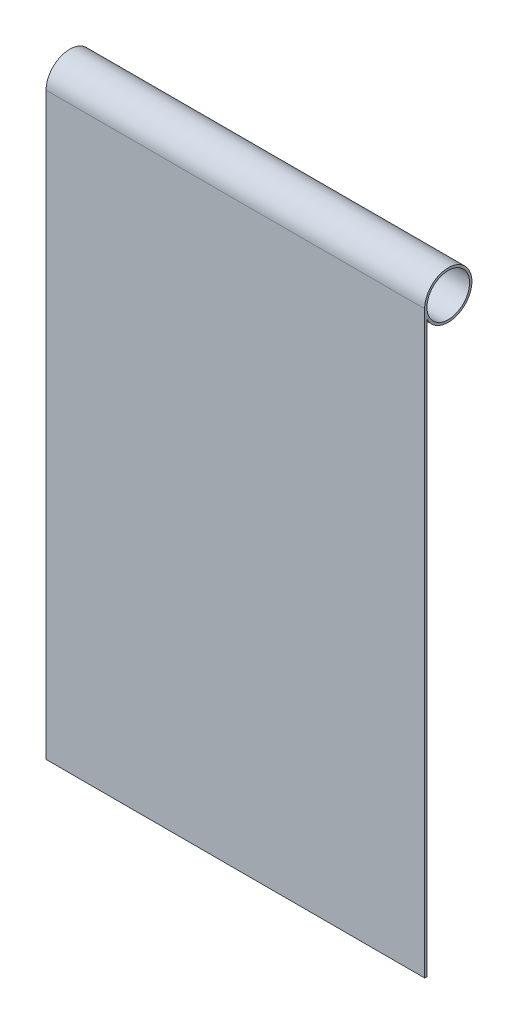
ISO-10303-21;
HEADER;
FILE_DESCRIPTION(('STEP AP214'),'2;1');
FILE_NAME('part.step','',(''),(''),'','','');
FILE_SCHEMA(('AUTOMOTIVE_DESIGN { 1 0 10303 214 1 1 1 1 }'));
ENDSEC;
DATA;
#1=APPLICATION_CONTEXT('core data for automotive mechanical design processes');
#2=APPLICATION_PROTOCOL_DEFINITION('international standard','automotive_design',2000,#1);
#3=PRODUCT_CONTEXT('',#1,'mechanical');
#4=PRODUCT('Part','Part','',(#3));
#5=PRODUCT_RELATED_PRODUCT_CATEGORY('part','',(#4));
#6=PRODUCT_DEFINITION_FORMATION('','',#4);
#7=PRODUCT_DEFINITION_CONTEXT('part definition',#1,'design');
#8=PRODUCT_DEFINITION('design','',#6,#7);
#9=PRODUCT_DEFINITION_SHAPE('','',#8);
#10=(LENGTH_UNIT() NAMED_UNIT(*) SI_UNIT(.MILLI.,.METRE.));
#11=(NAMED_UNIT(*) PLANE_ANGLE_UNIT() SI_UNIT($,.RADIAN.));
#12=(NAMED_UNIT(*) SI_UNIT($,.STERADIAN.) SOLID_ANGLE_UNIT());
#13=UNCERTAINTY_MEASURE_WITH_UNIT(LENGTH_MEASURE(1.E-05),#10,'distance_accuracy_value','');
#14=(GEOMETRIC_REPRESENTATION_CONTEXT(3) GLOBAL_UNCERTAINTY_ASSIGNED_CONTEXT((#13)) GLOBAL_UNIT_ASSIGNED_CONTEXT((#10,
#11,#12)) REPRESENTATION_CONTEXT('',''));
#15=CARTESIAN_POINT('',(0.,0.,0.));
#16=DIRECTION('',(0.,0.,1.));
#17=DIRECTION('',(1.,0.,0.));
#18=AXIS2_PLACEMENT_3D('',#15,#16,#17);
#19=CARTESIAN_POINT('',(-80.,125.,0.));
#20=DIRECTION('',(1.,0.,0.));
#21=DIRECTION('',(0.,0.,-1.));
#22=AXIS2_PLACEMENT_3D('',#19,#20,#21);
#23=CYLINDRICAL_SURFACE('',#22,10.);
#24=DIRECTION('',(1.,0.,0.));
#25=VECTOR('',#24,1.);
#26=CARTESIAN_POINT('',(-80.,125.,10.));
#27=LINE('',#26,#25);
#28=CARTESIAN_POINT('',(-80.,125.,10.));
#29=VERTEX_POINT('',#28);
#30=CARTESIAN_POINT('',(80.,125.,10.));
#31=VERTEX_POINT('',#30);
#32=EDGE_CURVE('E36',#29,#31,#27,.T.);
#33=ORIENTED_EDGE('',*,*,#32,.T.);
#34=CARTESIAN_POINT('',(80.,125.,0.));
#35=DIRECTION('',(1.,0.,0.));
#36=DIRECTION('',(0.,0.,-1.));
#37=AXIS2_PLACEMENT_3D('',#34,#35,#36);
#38=CIRCLE('',#37,10.);
#39=CARTESIAN_POINT('',(80.,120.641101056459,9.));
#40=VERTEX_POINT('',#39);
#41=EDGE_CURVE('E73',#40,#31,#38,.T.);
#42=ORIENTED_EDGE('',*,*,#41,.F.);
#43=DIRECTION('',(1.,0.,0.));
#44=VECTOR('',#43,1.);
#45=CARTESIAN_POINT('',(-80.,120.641101056459,9.));
#46=LINE('',#45,#44);
#47=CARTESIAN_POINT('',(-80.,120.641101056459,9.));
#48=VERTEX_POINT('',#47);
#49=EDGE_CURVE('E11',#48,#40,#46,.T.);
#50=ORIENTED_EDGE('',*,*,#49,.F.);
#51=CARTESIAN_POINT('',(-80.,125.,0.));
#52=DIRECTION('',(1.,0.,0.));
#53=DIRECTION('',(0.,0.,-1.));
#54=AXIS2_PLACEMENT_3D('',#51,#52,#53);
#55=CIRCLE('',#54,10.);
#56=EDGE_CURVE('E74',#48,#29,#55,.T.);
#57=ORIENTED_EDGE('',*,*,#56,.T.);
#58=EDGE_LOOP('',(#33,#42,#50,#57));
#59=FACE_BOUND('',#58,.T.);
#60=ADVANCED_FACE('F33',(#59),#23,.T.);
#61=CARTESIAN_POINT('',(-80.,-120.,9.));
#62=DIRECTION('',(0.,0.,-1.));
#63=DIRECTION('',(0.,1.,0.));
#64=AXIS2_PLACEMENT_3D('',#61,#62,#63);
#65=PLANE('',#64);
#66=ORIENTED_EDGE('',*,*,#49,.T.);
#67=DIRECTION('',(0.,1.,0.));
#68=VECTOR('',#67,1.);
#69=CARTESIAN_POINT('',(80.,-120.,9.));
#70=LINE('',#69,#68);
#71=CARTESIAN_POINT('',(80.,-120.,9.));
#72=VERTEX_POINT('',#71);
#73=EDGE_CURVE('E91',#72,#40,#70,.T.);
#74=ORIENTED_EDGE('',*,*,#73,.F.);
#75=DIRECTION('',(1.,0.,0.));
#76=VECTOR('',#75,1.);
#77=CARTESIAN_POINT('',(-80.,-120.,9.));
#78=LINE('',#77,#76);
#79=CARTESIAN_POINT('',(-80.,-120.,9.));
#80=VERTEX_POINT('',#79);
#81=EDGE_CURVE('E41',#80,#72,#78,.T.);
#82=ORIENTED_EDGE('',*,*,#81,.F.);
#83=DIRECTION('',(0.,1.,0.));
#84=VECTOR('',#83,1.);
#85=CARTESIAN_POINT('',(-80.,-120.,9.));
#86=LINE('',#85,#84);
#87=EDGE_CURVE('E79',#80,#48,#86,.T.);
#88=ORIENTED_EDGE('',*,*,#87,.T.);
#89=EDGE_LOOP('',(#66,#74,#82,#88));
#90=FACE_BOUND('',#89,.T.);
#91=ADVANCED_FACE('F112',(#90),#65,.T.);
#92=CARTESIAN_POINT('',(-80.,-120.,9.99999999999997));
#93=DIRECTION('',(0.,-1.,0.));
#94=DIRECTION('',(0.,0.,-1.));
#95=AXIS2_PLACEMENT_3D('',#92,#93,#94);
#96=PLANE('',#95);
#97=ORIENTED_EDGE('',*,*,#81,.T.);
#98=DIRECTION('',(0.,0.,-1.));
#99=VECTOR('',#98,1.);
#100=CARTESIAN_POINT('',(80.,-120.,9.99999999999997));
#101=LINE('',#100,#99);
#102=CARTESIAN_POINT('',(80.,-120.,9.99999999999997));
#103=VERTEX_POINT('',#102);
#104=EDGE_CURVE('E86',#103,#72,#101,.T.);
#105=ORIENTED_EDGE('',*,*,#104,.F.);
#106=DIRECTION('',(1.,0.,0.));
#107=VECTOR('',#106,1.);
#108=CARTESIAN_POINT('',(-80.,-120.,9.99999999999997));
#109=LINE('',#108,#107);
#110=CARTESIAN_POINT('',(-80.,-120.,9.99999999999997));
#111=VERTEX_POINT('',#110);
#112=EDGE_CURVE('E78',#111,#103,#109,.T.);
#113=ORIENTED_EDGE('',*,*,#112,.F.);
#114=DIRECTION('',(0.,0.,-1.));
#115=VECTOR('',#114,1.);
#116=CARTESIAN_POINT('',(-80.,-120.,9.99999999999997));
#117=LINE('',#116,#115);
#118=EDGE_CURVE('E105',#111,#80,#117,.T.);
#119=ORIENTED_EDGE('',*,*,#118,.T.);
#120=EDGE_LOOP('',(#97,#105,#113,#119));
#121=FACE_BOUND('',#120,.T.);
#122=ADVANCED_FACE('F109',(#121),#96,.T.);
#123=CARTESIAN_POINT('',(-80.,125.,10.));
#124=DIRECTION('',(0.,0.,1.));
#125=DIRECTION('',(0.,-1.,0.));
#126=AXIS2_PLACEMENT_3D('',#123,#124,#125);
#127=PLANE('',#126);
#128=ORIENTED_EDGE('',*,*,#112,.T.);
#129=DIRECTION('',(0.,-1.,0.));
#130=VECTOR('',#129,1.);
#131=CARTESIAN_POINT('',(80.,125.,10.));
#132=LINE('',#131,#130);
#133=EDGE_CURVE('E81',#31,#103,#132,.T.);
#134=ORIENTED_EDGE('',*,*,#133,.F.);
#135=ORIENTED_EDGE('',*,*,#32,.F.);
#136=DIRECTION('',(0.,-1.,0.));
#137=VECTOR('',#136,1.);
#138=CARTESIAN_POINT('',(-80.,125.,10.));
#139=LINE('',#138,#137);
#140=EDGE_CURVE('E103',#29,#111,#139,.T.);
#141=ORIENTED_EDGE('',*,*,#140,.T.);
#142=EDGE_LOOP('',(#128,#134,#135,#141));
#143=FACE_BOUND('',#142,.T.);
#144=ADVANCED_FACE('F82',(#143),#127,.T.);
#145=CARTESIAN_POINT('',(-80.,125.,0.));
#146=DIRECTION('',(1.,0.,0.));
#147=DIRECTION('',(0.,0.,-1.));
#148=AXIS2_PLACEMENT_3D('',#145,#146,#147);
#149=PLANE('',#148);
#150=CARTESIAN_POINT('',(-80.,125.,0.));
#151=DIRECTION('',(1.,0.,0.));
#152=DIRECTION('',(0.,0.,-1.));
#153=AXIS2_PLACEMENT_3D('',#150,#151,#152);
#154=CIRCLE('',#153,9.);
#155=CARTESIAN_POINT('',(-80.,125.,-9.));
#156=VERTEX_POINT('',#155);
#157=EDGE_CURVE('E99',#156,#156,#154,.T.);
#158=ORIENTED_EDGE('',*,*,#157,.T.);
#159=EDGE_LOOP('',(#158));
#160=FACE_BOUND('',#159,.T.);
#161=ORIENTED_EDGE('',*,*,#56,.F.);
#162=ORIENTED_EDGE('',*,*,#87,.F.);
#163=ORIENTED_EDGE('',*,*,#118,.F.);
#164=ORIENTED_EDGE('',*,*,#140,.F.);
#165=EDGE_LOOP('',(#161,#162,#163,#164));
#166=FACE_BOUND('',#165,.T.);
#167=ADVANCED_FACE('F114',(#160,#166),#149,.F.);
#168=CARTESIAN_POINT('',(-80.,125.,0.));
#169=DIRECTION('',(1.,0.,0.));
#170=DIRECTION('',(0.,0.,-1.));
#171=AXIS2_PLACEMENT_3D('',#168,#169,#170);
#172=CYLINDRICAL_SURFACE('',#171,9.);
#173=ORIENTED_EDGE('',*,*,#157,.F.);
#174=EDGE_LOOP('',(#173));
#175=FACE_BOUND('',#174,.T.);
#176=CARTESIAN_POINT('',(80.,125.,0.));
#177=DIRECTION('',(1.,0.,0.));
#178=DIRECTION('',(0.,0.,-1.));
#179=AXIS2_PLACEMENT_3D('',#176,#177,#178);
#180=CIRCLE('',#179,9.);
#181=CARTESIAN_POINT('',(80.,125.,-9.));
#182=VERTEX_POINT('',#181);
#183=EDGE_CURVE('E92',#182,#182,#180,.T.);
#184=ORIENTED_EDGE('',*,*,#183,.T.);
#185=EDGE_LOOP('',(#184));
#186=FACE_BOUND('',#185,.T.);
#187=ADVANCED_FACE('F116',(#175,#186),#172,.F.);
#188=CARTESIAN_POINT('',(80.,125.,0.));
#189=DIRECTION('',(1.,0.,0.));
#190=DIRECTION('',(0.,0.,-1.));
#191=AXIS2_PLACEMENT_3D('',#188,#189,#190);
#192=PLANE('',#191);
#193=ORIENTED_EDGE('',*,*,#41,.T.);
#194=ORIENTED_EDGE('',*,*,#133,.T.);
#195=ORIENTED_EDGE('',*,*,#104,.T.);
#196=ORIENTED_EDGE('',*,*,#73,.T.);
#197=EDGE_LOOP('',(#193,#194,#195,#196));
#198=FACE_BOUND('',#197,.T.);
#199=ORIENTED_EDGE('',*,*,#183,.F.);
#200=EDGE_LOOP('',(#199));
#201=FACE_BOUND('',#200,.T.);
#202=ADVANCED_FACE('F89',(#198,#201),#192,.T.);
#203=CLOSED_SHELL('',(#60,#91,#122,#144,#167,#187,#202));
#204=MANIFOLD_SOLID_BREP('B2',#203);
#205=ADVANCED_BREP_SHAPE_REPRESENTATION('',(#18,#204),#14);
#206=SHAPE_DEFINITION_REPRESENTATION(#9,#205);
ENDSEC;
END-ISO-10303-21;
